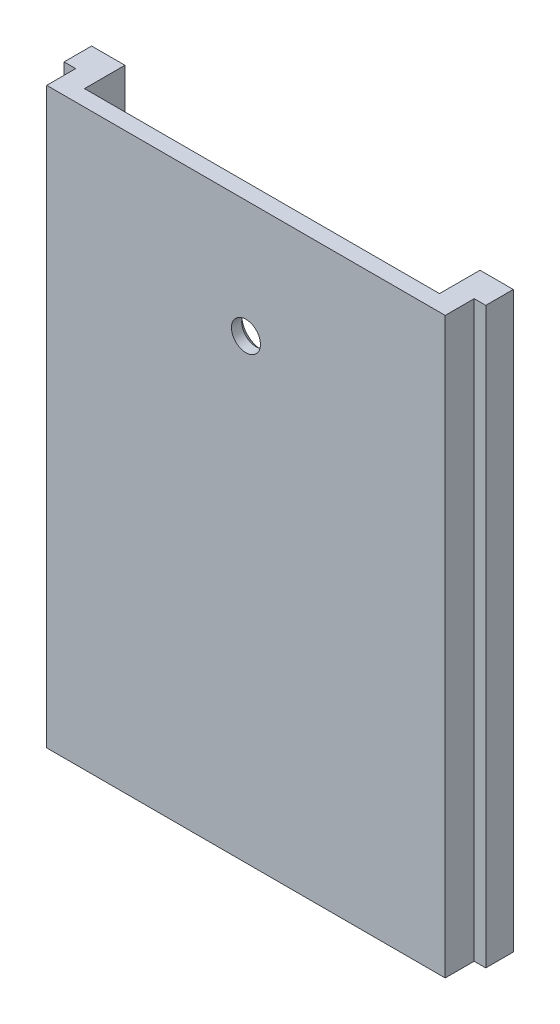
ISO-10303-21;
HEADER;
FILE_DESCRIPTION(('STEP AP214'),'2;1');
FILE_NAME('part.step','',(''),(''),'','','');
FILE_SCHEMA(('AUTOMOTIVE_DESIGN { 1 0 10303 214 1 1 1 1 }'));
ENDSEC;
DATA;
#1=APPLICATION_CONTEXT('core data for automotive mechanical design processes');
#2=APPLICATION_PROTOCOL_DEFINITION('international standard','automotive_design',2000,#1);
#3=PRODUCT_CONTEXT('',#1,'mechanical');
#4=PRODUCT('Part','Part','',(#3));
#5=PRODUCT_RELATED_PRODUCT_CATEGORY('part','',(#4));
#6=PRODUCT_DEFINITION_FORMATION('','',#4);
#7=PRODUCT_DEFINITION_CONTEXT('part definition',#1,'design');
#8=PRODUCT_DEFINITION('design','',#6,#7);
#9=PRODUCT_DEFINITION_SHAPE('','',#8);
#10=(LENGTH_UNIT() NAMED_UNIT(*) SI_UNIT(.MILLI.,.METRE.));
#11=(NAMED_UNIT(*) PLANE_ANGLE_UNIT() SI_UNIT($,.RADIAN.));
#12=(NAMED_UNIT(*) SI_UNIT($,.STERADIAN.) SOLID_ANGLE_UNIT());
#13=UNCERTAINTY_MEASURE_WITH_UNIT(LENGTH_MEASURE(1.E-05),#10,'distance_accuracy_value','');
#14=(GEOMETRIC_REPRESENTATION_CONTEXT(3) GLOBAL_UNCERTAINTY_ASSIGNED_CONTEXT((#13)) GLOBAL_UNIT_ASSIGNED_CONTEXT((#10,
#11,#12)) REPRESENTATION_CONTEXT('',''));
#15=CARTESIAN_POINT('',(0.,0.,0.));
#16=DIRECTION('',(0.,0.,1.));
#17=DIRECTION('',(1.,0.,0.));
#18=AXIS2_PLACEMENT_3D('',#15,#16,#17);
#19=CARTESIAN_POINT('',(130.,198.,-19.5));
#20=DIRECTION('',(1.,0.,0.));
#21=DIRECTION('',(0.,0.,-1.));
#22=AXIS2_PLACEMENT_3D('',#19,#20,#21);
#23=PLANE('',#22);
#24=DIRECTION('',(0.,0.,1.));
#25=VECTOR('',#24,1.);
#26=CARTESIAN_POINT('',(130.,108.,-142.036729187619));
#27=LINE('',#26,#25);
#28=CARTESIAN_POINT('',(130.,108.,-19.5));
#29=VERTEX_POINT('',#28);
#30=CARTESIAN_POINT('',(130.,108.,-5.53614866784526));
#31=VERTEX_POINT('',#30);
#32=EDGE_CURVE('E365',#29,#31,#27,.T.);
#33=ORIENTED_EDGE('',*,*,#32,.T.);
#34=DIRECTION('',(0.,-1.,0.));
#35=VECTOR('',#34,1.);
#36=CARTESIAN_POINT('',(130.,198.,-5.53614866784526));
#37=LINE('',#36,#35);
#38=CARTESIAN_POINT('',(130.,198.,-5.53614866784526));
#39=VERTEX_POINT('',#38);
#40=EDGE_CURVE('E253',#39,#31,#37,.T.);
#41=ORIENTED_EDGE('',*,*,#40,.F.);
#42=DIRECTION('',(0.,0.,1.));
#43=VECTOR('',#42,1.);
#44=CARTESIAN_POINT('',(130.,198.,-19.5));
#45=LINE('',#44,#43);
#46=CARTESIAN_POINT('',(130.,198.,-19.5));
#47=VERTEX_POINT('',#46);
#48=EDGE_CURVE('E335',#47,#39,#45,.T.);
#49=ORIENTED_EDGE('',*,*,#48,.F.);
#50=DIRECTION('',(0.,-1.,0.));
#51=VECTOR('',#50,1.);
#52=CARTESIAN_POINT('',(130.,198.,-19.5));
#53=LINE('',#52,#51);
#54=EDGE_CURVE('E248',#47,#29,#53,.T.);
#55=ORIENTED_EDGE('',*,*,#54,.T.);
#56=EDGE_LOOP('',(#33,#41,#49,#55));
#57=FACE_BOUND('',#56,.T.);
#58=ADVANCED_FACE('F47',(#57),#23,.F.);
#59=DIRECTION('',(0.,0.,1.));
#60=VECTOR('',#59,1.);
#61=CARTESIAN_POINT('',(130.,105.,-142.036729187619));
#62=LINE('',#61,#60);
#63=CARTESIAN_POINT('',(130.,105.,-19.5));
#64=VERTEX_POINT('',#63);
#65=CARTESIAN_POINT('',(130.,105.,-5.53614866784526));
#66=VERTEX_POINT('',#65);
#67=EDGE_CURVE('E355',#64,#66,#62,.T.);
#68=ORIENTED_EDGE('',*,*,#67,.F.);
#69=CARTESIAN_POINT('',(130.,0.,-19.5));
#70=VERTEX_POINT('',#69);
#71=EDGE_CURVE('E252',#64,#70,#53,.T.);
#72=ORIENTED_EDGE('',*,*,#71,.T.);
#73=DIRECTION('',(0.,0.,1.));
#74=VECTOR('',#73,1.);
#75=CARTESIAN_POINT('',(130.,0.,-19.5));
#76=LINE('',#75,#74);
#77=CARTESIAN_POINT('',(130.,0.,-5.53614866784526));
#78=VERTEX_POINT('',#77);
#79=EDGE_CURVE('E203',#70,#78,#76,.T.);
#80=ORIENTED_EDGE('',*,*,#79,.T.);
#81=EDGE_CURVE('E257',#66,#78,#37,.T.);
#82=ORIENTED_EDGE('',*,*,#81,.F.);
#83=EDGE_LOOP('',(#68,#72,#80,#82));
#84=FACE_BOUND('',#83,.T.);
#85=ADVANCED_FACE('F285',(#84),#23,.F.);
#86=CARTESIAN_POINT('',(7.50000000000002,198.,-5.53614866784525));
#87=DIRECTION('',(0.,0.,-1.));
#88=DIRECTION('',(-1.,0.,0.));
#89=AXIS2_PLACEMENT_3D('',#86,#87,#88);
#90=PLANE('',#89);
#91=CARTESIAN_POINT('',(68.75,157.452965679912,-5.53614866784526));
#92=DIRECTION('',(0.,0.,-1.));
#93=DIRECTION('',(-1.,0.,0.));
#94=AXIS2_PLACEMENT_3D('',#91,#92,#93);
#95=CIRCLE('',#94,7.00000000000003);
#96=CARTESIAN_POINT('',(61.75,157.452965679912,-5.53614866784526));
#97=VERTEX_POINT('',#96);
#98=EDGE_CURVE('E11',#97,#97,#95,.F.);
#99=ORIENTED_EDGE('',*,*,#98,.T.);
#100=EDGE_LOOP('',(#99));
#101=FACE_BOUND('',#100,.T.);
#102=ORIENTED_EDGE('',*,*,#40,.T.);
#103=DIRECTION('',(1.,0.,0.));
#104=VECTOR('',#103,1.);
#105=CARTESIAN_POINT('',(130.,108.,-5.53614866784526));
#106=LINE('',#105,#104);
#107=CARTESIAN_POINT('',(7.50000000000002,108.,-5.53614866784525));
#108=VERTEX_POINT('',#107);
#109=EDGE_CURVE('E368',#108,#31,#106,.T.);
#110=ORIENTED_EDGE('',*,*,#109,.F.);
#111=DIRECTION('',(0.,-1.,0.));
#112=VECTOR('',#111,1.);
#113=CARTESIAN_POINT('',(7.50000000000002,198.,-5.53614866784525));
#114=LINE('',#113,#112);
#115=CARTESIAN_POINT('',(7.50000000000002,198.,-5.53614866784525));
#116=VERTEX_POINT('',#115);
#117=EDGE_CURVE('E258',#116,#108,#114,.T.);
#118=ORIENTED_EDGE('',*,*,#117,.F.);
#119=DIRECTION('',(1.,0.,0.));
#120=VECTOR('',#119,1.);
#121=CARTESIAN_POINT('',(7.50000000000002,198.,-5.53614866784525));
#122=LINE('',#121,#120);
#123=EDGE_CURVE('E338',#116,#39,#122,.T.);
#124=ORIENTED_EDGE('',*,*,#123,.T.);
#125=EDGE_LOOP('',(#102,#110,#118,#124));
#126=FACE_BOUND('',#125,.T.);
#127=ADVANCED_FACE('F292',(#101,#126),#90,.T.);
#128=CARTESIAN_POINT('',(7.50000000000002,105.,-5.53614866784525));
#129=VERTEX_POINT('',#128);
#130=CARTESIAN_POINT('',(7.50000000000002,0.,-5.53614866784525));
#131=VERTEX_POINT('',#130);
#132=EDGE_CURVE('E262',#129,#131,#114,.T.);
#133=ORIENTED_EDGE('',*,*,#132,.F.);
#134=DIRECTION('',(-1.,0.,0.));
#135=VECTOR('',#134,1.);
#136=CARTESIAN_POINT('',(130.,105.,-5.53614866784526));
#137=LINE('',#136,#135);
#138=EDGE_CURVE('E372',#66,#129,#137,.T.);
#139=ORIENTED_EDGE('',*,*,#138,.F.);
#140=ORIENTED_EDGE('',*,*,#81,.T.);
#141=DIRECTION('',(1.,0.,0.));
#142=VECTOR('',#141,1.);
#143=CARTESIAN_POINT('',(7.50000000000002,0.,-5.53614866784525));
#144=LINE('',#143,#142);
#145=EDGE_CURVE('E199',#131,#78,#144,.T.);
#146=ORIENTED_EDGE('',*,*,#145,.F.);
#147=EDGE_LOOP('',(#133,#139,#140,#146));
#148=FACE_BOUND('',#147,.T.);
#149=ADVANCED_FACE('F301',(#148),#90,.T.);
#150=CARTESIAN_POINT('',(7.50000000000002,198.,-19.5));
#151=DIRECTION('',(1.,0.,0.));
#152=DIRECTION('',(0.,0.,-1.));
#153=AXIS2_PLACEMENT_3D('',#150,#151,#152);
#154=PLANE('',#153);
#155=ORIENTED_EDGE('',*,*,#117,.T.);
#156=DIRECTION('',(0.,0.,1.));
#157=VECTOR('',#156,1.);
#158=CARTESIAN_POINT('',(7.5,108.,-142.036729187619));
#159=LINE('',#158,#157);
#160=CARTESIAN_POINT('',(7.50000000000002,108.,-19.4999999999999));
#161=VERTEX_POINT('',#160);
#162=EDGE_CURVE('E361',#161,#108,#159,.T.);
#163=ORIENTED_EDGE('',*,*,#162,.F.);
#164=DIRECTION('',(0.,-1.,0.));
#165=VECTOR('',#164,1.);
#166=CARTESIAN_POINT('',(7.50000000000002,198.,-19.5));
#167=LINE('',#166,#165);
#168=CARTESIAN_POINT('',(7.50000000000002,198.,-19.5));
#169=VERTEX_POINT('',#168);
#170=EDGE_CURVE('E263',#169,#161,#167,.T.);
#171=ORIENTED_EDGE('',*,*,#170,.F.);
#172=DIRECTION('',(0.,0.,1.));
#173=VECTOR('',#172,1.);
#174=CARTESIAN_POINT('',(7.50000000000002,198.,-19.5));
#175=LINE('',#174,#173);
#176=EDGE_CURVE('E342',#169,#116,#175,.T.);
#177=ORIENTED_EDGE('',*,*,#176,.T.);
#178=EDGE_LOOP('',(#155,#163,#171,#177));
#179=FACE_BOUND('',#178,.T.);
#180=ADVANCED_FACE('F303',(#179),#154,.T.);
#181=CARTESIAN_POINT('',(7.50000000000002,105.,-19.5));
#182=VERTEX_POINT('',#181);
#183=CARTESIAN_POINT('',(7.50000000000002,0.,-19.5));
#184=VERTEX_POINT('',#183);
#185=EDGE_CURVE('E267',#182,#184,#167,.T.);
#186=ORIENTED_EDGE('',*,*,#185,.F.);
#187=DIRECTION('',(0.,0.,1.));
#188=VECTOR('',#187,1.);
#189=CARTESIAN_POINT('',(7.5,105.,-142.036729187619));
#190=LINE('',#189,#188);
#191=EDGE_CURVE('E64',#182,#129,#190,.T.);
#192=ORIENTED_EDGE('',*,*,#191,.T.);
#193=ORIENTED_EDGE('',*,*,#132,.T.);
#194=DIRECTION('',(0.,0.,1.));
#195=VECTOR('',#194,1.);
#196=CARTESIAN_POINT('',(7.50000000000002,0.,-19.5));
#197=LINE('',#196,#195);
#198=EDGE_CURVE('E195',#184,#131,#197,.T.);
#199=ORIENTED_EDGE('',*,*,#198,.F.);
#200=EDGE_LOOP('',(#186,#192,#193,#199));
#201=FACE_BOUND('',#200,.T.);
#202=ADVANCED_FACE('F305',(#201),#154,.T.);
#203=CARTESIAN_POINT('',(-3.99999999999998,198.,-10.));
#204=DIRECTION('',(-1.,0.,0.));
#205=DIRECTION('',(0.,0.,1.));
#206=AXIS2_PLACEMENT_3D('',#203,#204,#205);
#207=PLANE('',#206);
#208=DIRECTION('',(0.,0.,-1.));
#209=VECTOR('',#208,1.);
#210=CARTESIAN_POINT('',(-3.99999999999998,0.,-10.));
#211=LINE('',#210,#209);
#212=CARTESIAN_POINT('',(-3.99999999999998,0.,-10.));
#213=VERTEX_POINT('',#212);
#214=CARTESIAN_POINT('',(-3.99999999999998,0.,-19.5));
#215=VERTEX_POINT('',#214);
#216=EDGE_CURVE('E186',#213,#215,#211,.T.);
#217=ORIENTED_EDGE('',*,*,#216,.F.);
#218=DIRECTION('',(0.,-1.,0.));
#219=VECTOR('',#218,1.);
#220=CARTESIAN_POINT('',(-3.99999999999998,198.,-10.));
#221=LINE('',#220,#219);
#222=CARTESIAN_POINT('',(-3.99999999999998,198.,-10.));
#223=VERTEX_POINT('',#222);
#224=EDGE_CURVE('E73',#223,#213,#221,.T.);
#225=ORIENTED_EDGE('',*,*,#224,.F.);
#226=DIRECTION('',(0.,0.,-1.));
#227=VECTOR('',#226,1.);
#228=CARTESIAN_POINT('',(-3.99999999999998,198.,-10.));
#229=LINE('',#228,#227);
#230=CARTESIAN_POINT('',(-3.99999999999998,198.,-19.5));
#231=VERTEX_POINT('',#230);
#232=EDGE_CURVE('E229',#223,#231,#229,.T.);
#233=ORIENTED_EDGE('',*,*,#232,.T.);
#234=DIRECTION('',(0.,-1.,0.));
#235=VECTOR('',#234,1.);
#236=CARTESIAN_POINT('',(-3.99999999999998,198.,-19.5));
#237=LINE('',#236,#235);
#238=EDGE_CURVE('E124',#231,#215,#237,.T.);
#239=ORIENTED_EDGE('',*,*,#238,.T.);
#240=EDGE_LOOP('',(#217,#225,#233,#239));
#241=FACE_BOUND('',#240,.T.);
#242=ADVANCED_FACE('F307',(#241),#207,.T.);
#243=CARTESIAN_POINT('',(0.,198.,-10.));
#244=DIRECTION('',(0.,0.,1.));
#245=DIRECTION('',(1.,0.,0.));
#246=AXIS2_PLACEMENT_3D('',#243,#244,#245);
#247=PLANE('',#246);
#248=DIRECTION('',(-1.,0.,0.));
#249=VECTOR('',#248,1.);
#250=CARTESIAN_POINT('',(0.,0.,-10.));
#251=LINE('',#250,#249);
#252=CARTESIAN_POINT('',(0.,0.,-10.));
#253=VERTEX_POINT('',#252);
#254=EDGE_CURVE('E225',#253,#213,#251,.T.);
#255=ORIENTED_EDGE('',*,*,#254,.F.);
#256=DIRECTION('',(0.,-1.,0.));
#257=VECTOR('',#256,1.);
#258=CARTESIAN_POINT('',(0.,198.,-10.));
#259=LINE('',#258,#257);
#260=CARTESIAN_POINT('',(0.,198.,-10.));
#261=VERTEX_POINT('',#260);
#262=EDGE_CURVE('E166',#261,#253,#259,.T.);
#263=ORIENTED_EDGE('',*,*,#262,.F.);
#264=DIRECTION('',(-1.,0.,0.));
#265=VECTOR('',#264,1.);
#266=CARTESIAN_POINT('',(0.,198.,-10.));
#267=LINE('',#266,#265);
#268=EDGE_CURVE('E179',#261,#223,#267,.T.);
#269=ORIENTED_EDGE('',*,*,#268,.T.);
#270=ORIENTED_EDGE('',*,*,#224,.T.);
#271=EDGE_LOOP('',(#255,#263,#269,#270));
#272=FACE_BOUND('',#271,.T.);
#273=ADVANCED_FACE('F309',(#272),#247,.T.);
#274=CARTESIAN_POINT('',(0.,198.,0.));
#275=DIRECTION('',(-1.,0.,0.));
#276=DIRECTION('',(0.,0.,1.));
#277=AXIS2_PLACEMENT_3D('',#274,#275,#276);
#278=PLANE('',#277);
#279=DIRECTION('',(0.,0.,-1.));
#280=VECTOR('',#279,1.);
#281=CARTESIAN_POINT('',(0.,0.,0.));
#282=LINE('',#281,#280);
#283=CARTESIAN_POINT('',(0.,0.,0.));
#284=VERTEX_POINT('',#283);
#285=EDGE_CURVE('E162',#284,#253,#282,.T.);
#286=ORIENTED_EDGE('',*,*,#285,.F.);
#287=DIRECTION('',(0.,-1.,0.));
#288=VECTOR('',#287,1.);
#289=CARTESIAN_POINT('',(0.,198.,0.));
#290=LINE('',#289,#288);
#291=CARTESIAN_POINT('',(0.,198.,0.));
#292=VERTEX_POINT('',#291);
#293=EDGE_CURVE('E155',#292,#284,#290,.T.);
#294=ORIENTED_EDGE('',*,*,#293,.F.);
#295=DIRECTION('',(0.,0.,-1.));
#296=VECTOR('',#295,1.);
#297=CARTESIAN_POINT('',(0.,198.,0.));
#298=LINE('',#297,#296);
#299=EDGE_CURVE('E159',#292,#261,#298,.T.);
#300=ORIENTED_EDGE('',*,*,#299,.T.);
#301=ORIENTED_EDGE('',*,*,#262,.T.);
#302=EDGE_LOOP('',(#286,#294,#300,#301));
#303=FACE_BOUND('',#302,.T.);
#304=ADVANCED_FACE('F157',(#303),#278,.T.);
#305=CARTESIAN_POINT('',(0.,198.,0.));
#306=DIRECTION('',(0.,0.,-1.));
#307=DIRECTION('',(-1.,0.,0.));
#308=AXIS2_PLACEMENT_3D('',#305,#306,#307);
#309=PLANE('',#308);
#310=CARTESIAN_POINT('',(68.75,157.452965679912,0.));
#311=DIRECTION('',(0.,0.,1.));
#312=DIRECTION('',(1.,0.,0.));
#313=AXIS2_PLACEMENT_3D('',#310,#311,#312);
#314=CIRCLE('',#313,5.00000000000001);
#315=CARTESIAN_POINT('',(73.75,157.452965679912,0.));
#316=VERTEX_POINT('',#315);
#317=EDGE_CURVE('E375',#316,#316,#314,.T.);
#318=ORIENTED_EDGE('',*,*,#317,.F.);
#319=EDGE_LOOP('',(#318));
#320=FACE_BOUND('',#319,.T.);
#321=DIRECTION('',(1.,0.,0.));
#322=VECTOR('',#321,1.);
#323=CARTESIAN_POINT('',(0.,0.,0.));
#324=LINE('',#323,#322);
#325=CARTESIAN_POINT('',(137.5,0.,0.));
#326=VERTEX_POINT('',#325);
#327=EDGE_CURVE('E220',#284,#326,#324,.T.);
#328=ORIENTED_EDGE('',*,*,#327,.T.);
#329=DIRECTION('',(0.,-1.,0.));
#330=VECTOR('',#329,1.);
#331=CARTESIAN_POINT('',(137.5,198.,0.));
#332=LINE('',#331,#330);
#333=CARTESIAN_POINT('',(137.5,198.,0.));
#334=VERTEX_POINT('',#333);
#335=EDGE_CURVE('E167',#334,#326,#332,.T.);
#336=ORIENTED_EDGE('',*,*,#335,.F.);
#337=DIRECTION('',(1.,0.,0.));
#338=VECTOR('',#337,1.);
#339=CARTESIAN_POINT('',(0.,198.,0.));
#340=LINE('',#339,#338);
#341=EDGE_CURVE('E170',#292,#334,#340,.T.);
#342=ORIENTED_EDGE('',*,*,#341,.F.);
#343=ORIENTED_EDGE('',*,*,#293,.T.);
#344=EDGE_LOOP('',(#328,#336,#342,#343));
#345=FACE_BOUND('',#344,.T.);
#346=ADVANCED_FACE('F171',(#320,#345),#309,.F.);
#347=CARTESIAN_POINT('',(137.5,198.,0.));
#348=DIRECTION('',(-1.,0.,0.));
#349=DIRECTION('',(0.,0.,1.));
#350=AXIS2_PLACEMENT_3D('',#347,#348,#349);
#351=PLANE('',#350);
#352=DIRECTION('',(0.,0.,-1.));
#353=VECTOR('',#352,1.);
#354=CARTESIAN_POINT('',(137.5,0.,0.));
#355=LINE('',#354,#353);
#356=CARTESIAN_POINT('',(137.5,0.,-10.));
#357=VERTEX_POINT('',#356);
#358=EDGE_CURVE('E217',#326,#357,#355,.T.);
#359=ORIENTED_EDGE('',*,*,#358,.T.);
#360=DIRECTION('',(0.,-1.,0.));
#361=VECTOR('',#360,1.);
#362=CARTESIAN_POINT('',(137.5,198.,-10.));
#363=LINE('',#362,#361);
#364=CARTESIAN_POINT('',(137.5,198.,-10.));
#365=VERTEX_POINT('',#364);
#366=EDGE_CURVE('E236',#365,#357,#363,.T.);
#367=ORIENTED_EDGE('',*,*,#366,.F.);
#368=DIRECTION('',(0.,0.,-1.));
#369=VECTOR('',#368,1.);
#370=CARTESIAN_POINT('',(137.5,198.,0.));
#371=LINE('',#370,#369);
#372=EDGE_CURVE('E176',#334,#365,#371,.T.);
#373=ORIENTED_EDGE('',*,*,#372,.F.);
#374=ORIENTED_EDGE('',*,*,#335,.T.);
#375=EDGE_LOOP('',(#359,#367,#373,#374));
#376=FACE_BOUND('',#375,.T.);
#377=ADVANCED_FACE('F321',(#376),#351,.F.);
#378=CARTESIAN_POINT('',(137.5,198.,-10.));
#379=DIRECTION('',(0.,0.,-1.));
#380=DIRECTION('',(-1.,0.,0.));
#381=AXIS2_PLACEMENT_3D('',#378,#379,#380);
#382=PLANE('',#381);
#383=DIRECTION('',(1.,0.,0.));
#384=VECTOR('',#383,1.);
#385=CARTESIAN_POINT('',(137.5,0.,-10.));
#386=LINE('',#385,#384);
#387=CARTESIAN_POINT('',(141.5,0.,-10.));
#388=VERTEX_POINT('',#387);
#389=EDGE_CURVE('E214',#357,#388,#386,.T.);
#390=ORIENTED_EDGE('',*,*,#389,.T.);
#391=DIRECTION('',(0.,-1.,0.));
#392=VECTOR('',#391,1.);
#393=CARTESIAN_POINT('',(141.5,198.,-10.));
#394=LINE('',#393,#392);
#395=CARTESIAN_POINT('',(141.5,198.,-10.));
#396=VERTEX_POINT('',#395);
#397=EDGE_CURVE('E240',#396,#388,#394,.T.);
#398=ORIENTED_EDGE('',*,*,#397,.F.);
#399=DIRECTION('',(1.,0.,0.));
#400=VECTOR('',#399,1.);
#401=CARTESIAN_POINT('',(137.5,198.,-10.));
#402=LINE('',#401,#400);
#403=EDGE_CURVE('E325',#365,#396,#402,.T.);
#404=ORIENTED_EDGE('',*,*,#403,.F.);
#405=ORIENTED_EDGE('',*,*,#366,.T.);
#406=EDGE_LOOP('',(#390,#398,#404,#405));
#407=FACE_BOUND('',#406,.T.);
#408=ADVANCED_FACE('F388',(#407),#382,.F.);
#409=CARTESIAN_POINT('',(141.5,198.,-10.));
#410=DIRECTION('',(-1.,0.,0.));
#411=DIRECTION('',(0.,0.,1.));
#412=AXIS2_PLACEMENT_3D('',#409,#410,#411);
#413=PLANE('',#412);
#414=DIRECTION('',(0.,0.,-1.));
#415=VECTOR('',#414,1.);
#416=CARTESIAN_POINT('',(141.5,0.,-10.));
#417=LINE('',#416,#415);
#418=CARTESIAN_POINT('',(141.5,0.,-19.5));
#419=VERTEX_POINT('',#418);
#420=EDGE_CURVE('E211',#388,#419,#417,.T.);
#421=ORIENTED_EDGE('',*,*,#420,.T.);
#422=DIRECTION('',(0.,-1.,0.));
#423=VECTOR('',#422,1.);
#424=CARTESIAN_POINT('',(141.5,198.,-19.5));
#425=LINE('',#424,#423);
#426=CARTESIAN_POINT('',(141.5,198.,-19.5));
#427=VERTEX_POINT('',#426);
#428=EDGE_CURVE('E244',#427,#419,#425,.T.);
#429=ORIENTED_EDGE('',*,*,#428,.F.);
#430=DIRECTION('',(0.,0.,-1.));
#431=VECTOR('',#430,1.);
#432=CARTESIAN_POINT('',(141.5,198.,-10.));
#433=LINE('',#432,#431);
#434=EDGE_CURVE('E327',#396,#427,#433,.T.);
#435=ORIENTED_EDGE('',*,*,#434,.F.);
#436=ORIENTED_EDGE('',*,*,#397,.T.);
#437=EDGE_LOOP('',(#421,#429,#435,#436));
#438=FACE_BOUND('',#437,.T.);
#439=ADVANCED_FACE('F394',(#438),#413,.F.);
#440=CARTESIAN_POINT('',(141.5,198.,-19.5));
#441=DIRECTION('',(0.,0.,1.));
#442=DIRECTION('',(1.,0.,0.));
#443=AXIS2_PLACEMENT_3D('',#440,#441,#442);
#444=PLANE('',#443);
#445=DIRECTION('',(-1.,0.,0.));
#446=VECTOR('',#445,1.);
#447=CARTESIAN_POINT('',(141.5,0.,-19.5));
#448=LINE('',#447,#446);
#449=EDGE_CURVE('E207',#419,#70,#448,.T.);
#450=ORIENTED_EDGE('',*,*,#449,.T.);
#451=ORIENTED_EDGE('',*,*,#71,.F.);
#452=DIRECTION('',(1.,0.,0.));
#453=VECTOR('',#452,1.);
#454=CARTESIAN_POINT('',(130.,105.,-19.5));
#455=LINE('',#454,#453);
#456=EDGE_CURVE('E191',#182,#64,#455,.T.);
#457=ORIENTED_EDGE('',*,*,#456,.F.);
#458=ORIENTED_EDGE('',*,*,#185,.T.);
#459=DIRECTION('',(1.,0.,0.));
#460=VECTOR('',#459,1.);
#461=CARTESIAN_POINT('',(-3.99999999999998,0.,-19.5));
#462=LINE('',#461,#460);
#463=EDGE_CURVE('E190',#215,#184,#462,.T.);
#464=ORIENTED_EDGE('',*,*,#463,.F.);
#465=ORIENTED_EDGE('',*,*,#238,.F.);
#466=DIRECTION('',(1.,0.,0.));
#467=VECTOR('',#466,1.);
#468=CARTESIAN_POINT('',(-3.99999999999998,198.,-19.5));
#469=LINE('',#468,#467);
#470=EDGE_CURVE('E346',#231,#169,#469,.T.);
#471=ORIENTED_EDGE('',*,*,#470,.T.);
#472=ORIENTED_EDGE('',*,*,#170,.T.);
#473=DIRECTION('',(-1.,0.,0.));
#474=VECTOR('',#473,1.);
#475=CARTESIAN_POINT('',(130.,108.,-19.5));
#476=LINE('',#475,#474);
#477=EDGE_CURVE('E351',#29,#161,#476,.T.);
#478=ORIENTED_EDGE('',*,*,#477,.F.);
#479=ORIENTED_EDGE('',*,*,#54,.F.);
#480=DIRECTION('',(-1.,0.,0.));
#481=VECTOR('',#480,1.);
#482=CARTESIAN_POINT('',(141.5,198.,-19.5));
#483=LINE('',#482,#481);
#484=EDGE_CURVE('E332',#427,#47,#483,.T.);
#485=ORIENTED_EDGE('',*,*,#484,.F.);
#486=ORIENTED_EDGE('',*,*,#428,.T.);
#487=EDGE_LOOP('',(#450,#451,#457,#458,#464,#465,#471,#472,#478,#479,#485,#486));
#488=FACE_BOUND('',#487,.T.);
#489=ADVANCED_FACE('F297',(#488),#444,.F.);
#490=CARTESIAN_POINT('',(0.,198.,0.));
#491=DIRECTION('',(0.,-1.,0.));
#492=DIRECTION('',(0.,0.,-1.));
#493=AXIS2_PLACEMENT_3D('',#490,#491,#492);
#494=PLANE('',#493);
#495=ORIENTED_EDGE('',*,*,#232,.F.);
#496=ORIENTED_EDGE('',*,*,#268,.F.);
#497=ORIENTED_EDGE('',*,*,#299,.F.);
#498=ORIENTED_EDGE('',*,*,#341,.T.);
#499=ORIENTED_EDGE('',*,*,#372,.T.);
#500=ORIENTED_EDGE('',*,*,#403,.T.);
#501=ORIENTED_EDGE('',*,*,#434,.T.);
#502=ORIENTED_EDGE('',*,*,#484,.T.);
#503=ORIENTED_EDGE('',*,*,#48,.T.);
#504=ORIENTED_EDGE('',*,*,#123,.F.);
#505=ORIENTED_EDGE('',*,*,#176,.F.);
#506=ORIENTED_EDGE('',*,*,#470,.F.);
#507=EDGE_LOOP('',(#495,#496,#497,#498,#499,#500,#501,#502,#503,#504,#505,#506));
#508=FACE_BOUND('',#507,.T.);
#509=ADVANCED_FACE('F178',(#508),#494,.F.);
#510=CARTESIAN_POINT('',(0.,0.,0.));
#511=DIRECTION('',(0.,-1.,0.));
#512=DIRECTION('',(0.,0.,-1.));
#513=AXIS2_PLACEMENT_3D('',#510,#511,#512);
#514=PLANE('',#513);
#515=ORIENTED_EDGE('',*,*,#216,.T.);
#516=ORIENTED_EDGE('',*,*,#463,.T.);
#517=ORIENTED_EDGE('',*,*,#198,.T.);
#518=ORIENTED_EDGE('',*,*,#145,.T.);
#519=ORIENTED_EDGE('',*,*,#79,.F.);
#520=ORIENTED_EDGE('',*,*,#449,.F.);
#521=ORIENTED_EDGE('',*,*,#420,.F.);
#522=ORIENTED_EDGE('',*,*,#389,.F.);
#523=ORIENTED_EDGE('',*,*,#358,.F.);
#524=ORIENTED_EDGE('',*,*,#327,.F.);
#525=ORIENTED_EDGE('',*,*,#285,.T.);
#526=ORIENTED_EDGE('',*,*,#254,.T.);
#527=EDGE_LOOP('',(#515,#516,#517,#518,#519,#520,#521,#522,#523,#524,#525,#526));
#528=FACE_BOUND('',#527,.T.);
#529=ADVANCED_FACE('F317',(#528),#514,.T.);
#530=CARTESIAN_POINT('',(130.,108.,-142.036729187619));
#531=DIRECTION('',(0.,-1.,0.));
#532=DIRECTION('',(0.,0.,-1.));
#533=AXIS2_PLACEMENT_3D('',#530,#531,#532);
#534=PLANE('',#533);
#535=ORIENTED_EDGE('',*,*,#32,.F.);
#536=ORIENTED_EDGE('',*,*,#477,.T.);
#537=ORIENTED_EDGE('',*,*,#162,.T.);
#538=ORIENTED_EDGE('',*,*,#109,.T.);
#539=EDGE_LOOP('',(#535,#536,#537,#538));
#540=FACE_BOUND('',#539,.T.);
#541=ADVANCED_FACE('F439',(#540),#534,.F.);
#542=CARTESIAN_POINT('',(130.,105.,-142.036729187619));
#543=DIRECTION('',(0.,1.,0.));
#544=DIRECTION('',(0.,0.,1.));
#545=AXIS2_PLACEMENT_3D('',#542,#543,#544);
#546=PLANE('',#545);
#547=ORIENTED_EDGE('',*,*,#191,.F.);
#548=ORIENTED_EDGE('',*,*,#456,.T.);
#549=ORIENTED_EDGE('',*,*,#67,.T.);
#550=ORIENTED_EDGE('',*,*,#138,.T.);
#551=EDGE_LOOP('',(#547,#548,#549,#550));
#552=FACE_BOUND('',#551,.T.);
#553=ADVANCED_FACE('F281',(#552),#546,.F.);
#554=CARTESIAN_POINT('',(68.75,157.452965679912,-10.));
#555=DIRECTION('',(0.,0.,1.));
#556=DIRECTION('',(1.,0.,0.));
#557=AXIS2_PLACEMENT_3D('',#554,#555,#556);
#558=CYLINDRICAL_SURFACE('',#557,5.00000000000001);
#559=CARTESIAN_POINT('',(68.75,157.452965679912,-3.53614866784524));
#560=DIRECTION('',(0.,0.,-1.));
#561=DIRECTION('',(-1.,0.,0.));
#562=AXIS2_PLACEMENT_3D('',#559,#560,#561);
#563=CIRCLE('',#562,5.00000000000001);
#564=CARTESIAN_POINT('',(63.75,157.452965679912,-3.53614866784524));
#565=VERTEX_POINT('',#564);
#566=EDGE_CURVE('E57',#565,#565,#563,.T.);
#567=ORIENTED_EDGE('',*,*,#566,.T.);
#568=EDGE_LOOP('',(#567));
#569=FACE_BOUND('',#568,.T.);
#570=ORIENTED_EDGE('',*,*,#317,.T.);
#571=EDGE_LOOP('',(#570));
#572=FACE_BOUND('',#571,.T.);
#573=ADVANCED_FACE('F273',(#569,#572),#558,.F.);
#574=CARTESIAN_POINT('',(68.75,157.452965679912,-3.53614866784524));
#575=DIRECTION('',(0.,0.,-1.));
#576=DIRECTION('',(-1.,0.,0.));
#577=AXIS2_PLACEMENT_3D('',#574,#575,#576);
#578=CONICAL_SURFACE('',#577,5.00000000000001,0.785398163397451);
#579=ORIENTED_EDGE('',*,*,#98,.F.);
#580=EDGE_LOOP('',(#579));
#581=FACE_BOUND('',#580,.T.);
#582=ORIENTED_EDGE('',*,*,#566,.F.);
#583=EDGE_LOOP('',(#582));
#584=FACE_BOUND('',#583,.T.);
#585=ADVANCED_FACE('F50',(#581,#584),#578,.F.);
#586=CLOSED_SHELL('',(#58,#85,#127,#149,#180,#202,#242,#273,#304,#346,#377,#408,#439,#489,#509,
#529,#541,#553,#573,#585));
#587=MANIFOLD_SOLID_BREP('B2',#586);
#588=ADVANCED_BREP_SHAPE_REPRESENTATION('',(#18,#587),#14);
#589=SHAPE_DEFINITION_REPRESENTATION(#9,#588);
ENDSEC;
END-ISO-10303-21;
